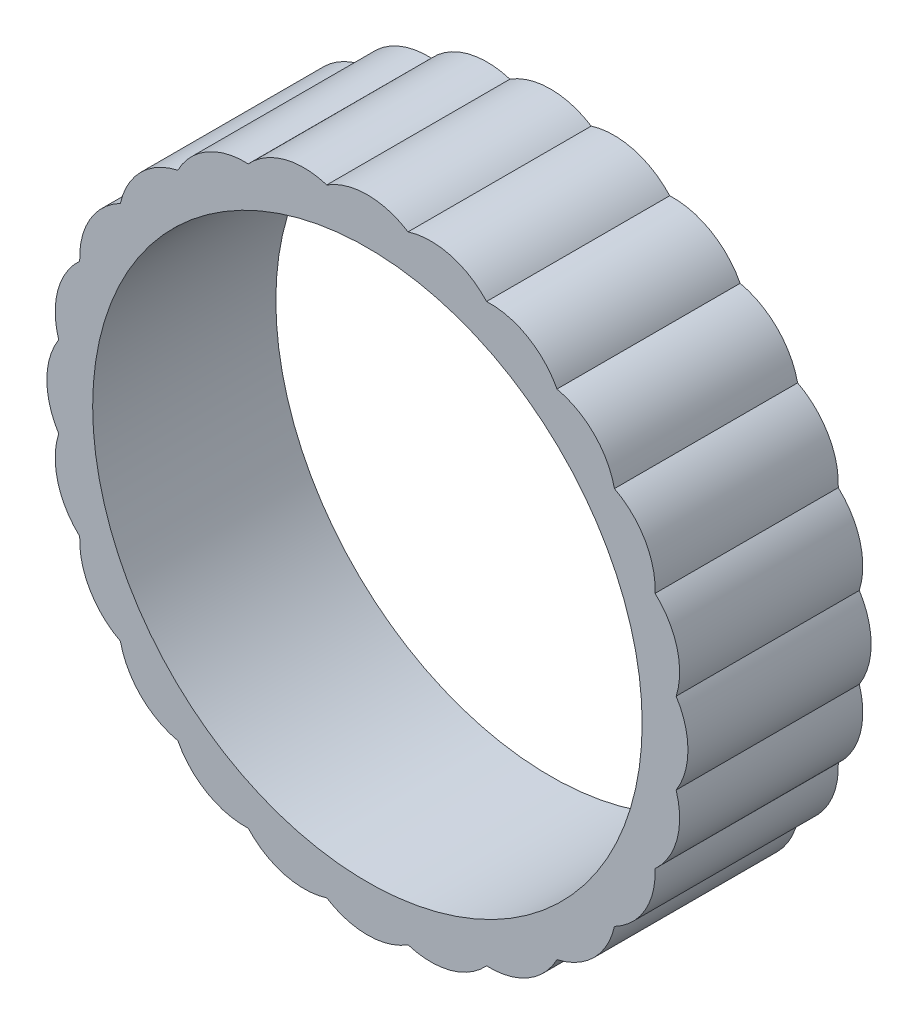
ISO-10303-21;
HEADER;
FILE_DESCRIPTION(('STEP AP214'),'2;1');
FILE_NAME('part.step','',(''),(''),'','','');
FILE_SCHEMA(('AUTOMOTIVE_DESIGN { 1 0 10303 214 1 1 1 1 }'));
ENDSEC;
DATA;
#1=APPLICATION_CONTEXT('core data for automotive mechanical design processes');
#2=APPLICATION_PROTOCOL_DEFINITION('international standard','automotive_design',2000,#1);
#3=PRODUCT_CONTEXT('',#1,'mechanical');
#4=PRODUCT('Part','Part','',(#3));
#5=PRODUCT_RELATED_PRODUCT_CATEGORY('part','',(#4));
#6=PRODUCT_DEFINITION_FORMATION('','',#4);
#7=PRODUCT_DEFINITION_CONTEXT('part definition',#1,'design');
#8=PRODUCT_DEFINITION('design','',#6,#7);
#9=PRODUCT_DEFINITION_SHAPE('','',#8);
#10=(LENGTH_UNIT() NAMED_UNIT(*) SI_UNIT(.MILLI.,.METRE.));
#11=(NAMED_UNIT(*) PLANE_ANGLE_UNIT() SI_UNIT($,.RADIAN.));
#12=(NAMED_UNIT(*) SI_UNIT($,.STERADIAN.) SOLID_ANGLE_UNIT());
#13=UNCERTAINTY_MEASURE_WITH_UNIT(LENGTH_MEASURE(1.E-05),#10,'distance_accuracy_value','');
#14=(GEOMETRIC_REPRESENTATION_CONTEXT(3) GLOBAL_UNCERTAINTY_ASSIGNED_CONTEXT((#13)) GLOBAL_UNIT_ASSIGNED_CONTEXT((#10,
#11,#12)) REPRESENTATION_CONTEXT('',''));
#15=CARTESIAN_POINT('',(0.,0.,0.));
#16=DIRECTION('',(0.,0.,1.));
#17=DIRECTION('',(1.,0.,0.));
#18=AXIS2_PLACEMENT_3D('',#15,#16,#17);
#19=CARTESIAN_POINT('',(0.,0.,10.));
#20=DIRECTION('',(0.,0.,1.));
#21=DIRECTION('',(1.,0.,0.));
#22=AXIS2_PLACEMENT_3D('',#19,#20,#21);
#23=PLANE('',#22);
#24=CARTESIAN_POINT('',(0.,13.3630319212231,10.));
#25=DIRECTION('',(0.,0.,1.));
#26=DIRECTION('',(-1.,0.,0.));
#27=AXIS2_PLACEMENT_3D('',#24,#25,#26);
#28=CIRCLE('',#27,4.1369680787769);
#29=CARTESIAN_POINT('',(2.21894526774064,16.8545626433548,10.));
#30=VERTEX_POINT('',#29);
#31=CARTESIAN_POINT('',(-2.21894526774089,16.8545626433548,10.));
#32=VERTEX_POINT('',#31);
#33=EDGE_CURVE('E210',#30,#32,#28,.T.);
#34=ORIENTED_EDGE('',*,*,#33,.T.);
#35=CARTESIAN_POINT('',(-3.45860716152547,12.9076976502346,10.));
#36=DIRECTION('',(0.,0.,1.));
#37=DIRECTION('',(-0.965925826289068,-0.258819045102521,0.));
#38=AXIS2_PLACEMENT_3D('',#35,#36,#37);
#39=CIRCLE('',#38,4.1369680787769);
#40=CARTESIAN_POINT('',(-6.50561835020655,15.7059520526919,10.));
#41=VERTEX_POINT('',#40);
#42=EDGE_CURVE('E48',#32,#41,#39,.T.);
#43=ORIENTED_EDGE('',*,*,#42,.T.);
#44=CARTESIAN_POINT('',(-6.68151596061156,11.5727251153616,10.));
#45=DIRECTION('',(0.,0.,1.));
#46=DIRECTION('',(-0.866025403784438,-0.500000000000001,0.));
#47=AXIS2_PLACEMENT_3D('',#44,#45,#46);
#48=CIRCLE('',#47,4.1369680787769);
#49=CARTESIAN_POINT('',(-10.3489442931483,13.487006784951,10.));
#50=VERTEX_POINT('',#49);
#51=EDGE_CURVE('E664',#41,#50,#48,.T.);
#52=ORIENTED_EDGE('',*,*,#51,.T.);
#53=CARTESIAN_POINT('',(-9.44909048870917,9.44909048870914,10.));
#54=DIRECTION('',(0.,0.,1.));
#55=DIRECTION('',(-0.707106781186546,-0.707106781186549,0.));
#56=AXIS2_PLACEMENT_3D('',#53,#54,#55);
#57=CIRCLE('',#56,4.1369680787769);
#58=CARTESIAN_POINT('',(-13.487006784951,10.3489442931482,10.));
#59=VERTEX_POINT('',#58);
#60=EDGE_CURVE('E655',#50,#59,#57,.T.);
#61=ORIENTED_EDGE('',*,*,#60,.T.);
#62=CARTESIAN_POINT('',(-11.5727251153616,6.68151596061152,10.));
#63=DIRECTION('',(0.,0.,1.));
#64=DIRECTION('',(-0.499999999999998,-0.86602540378444,0.));
#65=AXIS2_PLACEMENT_3D('',#62,#63,#64);
#66=CIRCLE('',#65,4.1369680787769);
#67=CARTESIAN_POINT('',(-15.7059520526919,6.50561835020648,10.));
#68=VERTEX_POINT('',#67);
#69=EDGE_CURVE('E646',#59,#68,#66,.T.);
#70=ORIENTED_EDGE('',*,*,#69,.T.);
#71=CARTESIAN_POINT('',(-12.9076976502346,3.45860716152543,10.));
#72=DIRECTION('',(0.,0.,1.));
#73=DIRECTION('',(-0.258819045102518,-0.965925826289069,0.));
#74=AXIS2_PLACEMENT_3D('',#71,#72,#73);
#75=CIRCLE('',#74,4.1369680787769);
#76=CARTESIAN_POINT('',(-16.8545626433548,2.21894526774081,10.));
#77=VERTEX_POINT('',#76);
#78=EDGE_CURVE('E637',#68,#77,#75,.T.);
#79=ORIENTED_EDGE('',*,*,#78,.T.);
#80=CARTESIAN_POINT('',(-13.3630319212231,0.,10.));
#81=DIRECTION('',(0.,0.,1.));
#82=DIRECTION('',(0.,-1.,0.));
#83=AXIS2_PLACEMENT_3D('',#80,#81,#82);
#84=CIRCLE('',#83,4.1369680787769);
#85=CARTESIAN_POINT('',(-16.8545626433548,-2.21894526774095,10.));
#86=VERTEX_POINT('',#85);
#87=EDGE_CURVE('E628',#77,#86,#84,.T.);
#88=ORIENTED_EDGE('',*,*,#87,.T.);
#89=CARTESIAN_POINT('',(-12.9076976502346,-3.45860716152552,10.));
#90=DIRECTION('',(0.,0.,1.));
#91=DIRECTION('',(0.258819045102525,-0.965925826289067,0.));
#92=AXIS2_PLACEMENT_3D('',#89,#90,#91);
#93=CIRCLE('',#92,4.1369680787769);
#94=CARTESIAN_POINT('',(-15.7059520526918,-6.50561835020661,10.));
#95=VERTEX_POINT('',#94);
#96=EDGE_CURVE('E619',#86,#95,#93,.T.);
#97=ORIENTED_EDGE('',*,*,#96,.T.);
#98=CARTESIAN_POINT('',(-11.5727251153615,-6.6815159606116,10.));
#99=DIRECTION('',(0.,0.,1.));
#100=DIRECTION('',(0.500000000000004,-0.866025403784436,0.));
#101=AXIS2_PLACEMENT_3D('',#98,#99,#100);
#102=CIRCLE('',#101,4.1369680787769);
#103=CARTESIAN_POINT('',(-13.4870067849509,-10.3489442931483,10.));
#104=VERTEX_POINT('',#103);
#105=EDGE_CURVE('E610',#95,#104,#102,.T.);
#106=ORIENTED_EDGE('',*,*,#105,.T.);
#107=CARTESIAN_POINT('',(-9.4490904887091,-9.4490904887092,10.));
#108=DIRECTION('',(0.,0.,1.));
#109=DIRECTION('',(0.707106781186551,-0.707106781186544,0.));
#110=AXIS2_PLACEMENT_3D('',#107,#108,#109);
#111=CIRCLE('',#110,4.1369680787769);
#112=CARTESIAN_POINT('',(-10.3489442931482,-13.4870067849511,10.));
#113=VERTEX_POINT('',#112);
#114=EDGE_CURVE('E601',#104,#113,#111,.T.);
#115=ORIENTED_EDGE('',*,*,#114,.T.);
#116=CARTESIAN_POINT('',(-6.68151596061148,-11.5727251153616,10.));
#117=DIRECTION('',(0.,0.,1.));
#118=DIRECTION('',(0.866025403784442,-0.499999999999995,0.));
#119=AXIS2_PLACEMENT_3D('',#116,#117,#118);
#120=CIRCLE('',#119,4.1369680787769);
#121=CARTESIAN_POINT('',(-6.50561835020642,-15.7059520526919,10.));
#122=VERTEX_POINT('',#121);
#123=EDGE_CURVE('E592',#113,#122,#120,.T.);
#124=ORIENTED_EDGE('',*,*,#123,.T.);
#125=CARTESIAN_POINT('',(-3.45860716152538,-12.9076976502346,10.));
#126=DIRECTION('',(0.,0.,1.));
#127=DIRECTION('',(0.96592582628907,-0.258819045102515,0.));
#128=AXIS2_PLACEMENT_3D('',#125,#126,#127);
#129=CIRCLE('',#128,4.1369680787769);
#130=CARTESIAN_POINT('',(-2.21894526774075,-16.8545626433548,10.));
#131=VERTEX_POINT('',#130);
#132=EDGE_CURVE('E583',#122,#131,#129,.T.);
#133=ORIENTED_EDGE('',*,*,#132,.T.);
#134=CARTESIAN_POINT('',(0.,-13.3630319212231,10.));
#135=DIRECTION('',(0.,0.,1.));
#136=DIRECTION('',(1.,0.,0.));
#137=AXIS2_PLACEMENT_3D('',#134,#135,#136);
#138=CIRCLE('',#137,4.1369680787769);
#139=CARTESIAN_POINT('',(2.21894526774089,-16.8545626433548,10.));
#140=VERTEX_POINT('',#139);
#141=EDGE_CURVE('E574',#131,#140,#138,.T.);
#142=ORIENTED_EDGE('',*,*,#141,.T.);
#143=CARTESIAN_POINT('',(3.45860716152556,-12.9076976502346,10.));
#144=DIRECTION('',(0.,0.,1.));
#145=DIRECTION('',(0.965925826289066,0.258819045102528,0.));
#146=AXIS2_PLACEMENT_3D('',#143,#144,#145);
#147=CIRCLE('',#146,4.1369680787769);
#148=CARTESIAN_POINT('',(6.50561835020666,-15.7059520526918,10.));
#149=VERTEX_POINT('',#148);
#150=EDGE_CURVE('E565',#140,#149,#147,.T.);
#151=ORIENTED_EDGE('',*,*,#150,.T.);
#152=CARTESIAN_POINT('',(6.68151596061164,-11.5727251153615,10.));
#153=DIRECTION('',(0.,0.,1.));
#154=DIRECTION('',(0.866025403784435,0.500000000000007,0.));
#155=AXIS2_PLACEMENT_3D('',#152,#153,#154);
#156=CIRCLE('',#155,4.1369680787769);
#157=CARTESIAN_POINT('',(10.3489442931484,-13.4870067849509,10.));
#158=VERTEX_POINT('',#157);
#159=EDGE_CURVE('E556',#149,#158,#156,.T.);
#160=ORIENTED_EDGE('',*,*,#159,.T.);
#161=CARTESIAN_POINT('',(9.44909048870923,-9.44909048870907,10.));
#162=DIRECTION('',(0.,0.,1.));
#163=DIRECTION('',(0.707106781186541,0.707106781186554,0.));
#164=AXIS2_PLACEMENT_3D('',#161,#162,#163);
#165=CIRCLE('',#164,4.1369680787769);
#166=CARTESIAN_POINT('',(13.4870067849511,-10.3489442931481,10.));
#167=VERTEX_POINT('',#166);
#168=EDGE_CURVE('E547',#158,#167,#165,.T.);
#169=ORIENTED_EDGE('',*,*,#168,.T.);
#170=CARTESIAN_POINT('',(11.5727251153616,-6.68151596061144,10.));
#171=DIRECTION('',(0.,0.,1.));
#172=DIRECTION('',(0.499999999999992,0.866025403784443,0.));
#173=AXIS2_PLACEMENT_3D('',#170,#171,#172);
#174=CIRCLE('',#173,4.1369680787769);
#175=CARTESIAN_POINT('',(15.7059520526919,-6.50561835020637,10.));
#176=VERTEX_POINT('',#175);
#177=EDGE_CURVE('E538',#167,#176,#174,.T.);
#178=ORIENTED_EDGE('',*,*,#177,.T.);
#179=CARTESIAN_POINT('',(12.9076976502347,-3.45860716152534,10.));
#180=DIRECTION('',(0.,0.,1.));
#181=DIRECTION('',(0.258819045102511,0.965925826289071,0.));
#182=AXIS2_PLACEMENT_3D('',#179,#180,#181);
#183=CIRCLE('',#182,4.1369680787769);
#184=CARTESIAN_POINT('',(16.8545626433548,-2.21894526774069,10.));
#185=VERTEX_POINT('',#184);
#186=EDGE_CURVE('E529',#176,#185,#183,.T.);
#187=ORIENTED_EDGE('',*,*,#186,.T.);
#188=CARTESIAN_POINT('',(13.3630319212231,1.39970329749947E-13,10.));
#189=DIRECTION('',(0.,0.,1.));
#190=DIRECTION('',(0.,1.,0.));
#191=AXIS2_PLACEMENT_3D('',#188,#189,#190);
#192=CIRCLE('',#191,4.1369680787769);
#193=CARTESIAN_POINT('',(16.8545626433548,2.21894526774107,10.));
#194=VERTEX_POINT('',#193);
#195=EDGE_CURVE('E520',#185,#194,#192,.T.);
#196=ORIENTED_EDGE('',*,*,#195,.T.);
#197=CARTESIAN_POINT('',(12.9076976502346,3.45860716152561,10.));
#198=DIRECTION('',(0.,0.,1.));
#199=DIRECTION('',(-0.258819045102531,0.965925826289065,0.));
#200=AXIS2_PLACEMENT_3D('',#197,#198,#199);
#201=CIRCLE('',#200,4.1369680787769);
#202=CARTESIAN_POINT('',(15.7059520526918,6.50561835020672,10.));
#203=VERTEX_POINT('',#202);
#204=EDGE_CURVE('E512',#194,#203,#201,.T.);
#205=ORIENTED_EDGE('',*,*,#204,.T.);
#206=CARTESIAN_POINT('',(11.5727251153615,6.68151596061169,10.));
#207=DIRECTION('',(0.,0.,1.));
#208=DIRECTION('',(-0.50000000000001,0.866025403784433,0.));
#209=AXIS2_PLACEMENT_3D('',#206,#207,#208);
#210=CIRCLE('',#209,4.1369680787769);
#211=CARTESIAN_POINT('',(13.4870067849509,10.3489442931484,10.));
#212=VERTEX_POINT('',#211);
#213=EDGE_CURVE('E497',#203,#212,#210,.T.);
#214=ORIENTED_EDGE('',*,*,#213,.T.);
#215=CARTESIAN_POINT('',(9.44909048870904,9.44909048870927,10.));
#216=DIRECTION('',(0.,0.,1.));
#217=DIRECTION('',(-0.707106781186556,0.707106781186539,0.));
#218=AXIS2_PLACEMENT_3D('',#215,#216,#217);
#219=CIRCLE('',#218,4.1369680787769);
#220=CARTESIAN_POINT('',(10.3489442931481,13.4870067849511,10.));
#221=VERTEX_POINT('',#220);
#222=EDGE_CURVE('E491',#212,#221,#219,.T.);
#223=ORIENTED_EDGE('',*,*,#222,.T.);
#224=CARTESIAN_POINT('',(6.6815159606114,11.5727251153617,10.));
#225=DIRECTION('',(0.,0.,1.));
#226=DIRECTION('',(-0.866025403784445,0.499999999999989,0.));
#227=AXIS2_PLACEMENT_3D('',#224,#225,#226);
#228=CIRCLE('',#227,4.1369680787769);
#229=CARTESIAN_POINT('',(6.50561835020631,15.705952052692,10.));
#230=VERTEX_POINT('',#229);
#231=EDGE_CURVE('E212',#221,#230,#228,.T.);
#232=ORIENTED_EDGE('',*,*,#231,.T.);
#233=CARTESIAN_POINT('',(3.45860716152529,12.9076976502347,10.));
#234=DIRECTION('',(0.,0.,1.));
#235=DIRECTION('',(-0.965925826289072,0.258819045102508,0.));
#236=AXIS2_PLACEMENT_3D('',#233,#234,#235);
#237=CIRCLE('',#236,4.1369680787769);
#238=EDGE_CURVE('E197',#230,#30,#237,.T.);
#239=ORIENTED_EDGE('',*,*,#238,.T.);
#240=EDGE_LOOP('',(#34,#43,#52,#61,#70,#79,#88,#97,#106,#115,#124,#133,#142,#151,#160,#169,#178,
#187,#196,#205,#214,#223,#232,#239));
#241=FACE_BOUND('',#240,.T.);
#242=CARTESIAN_POINT('',(0.,0.,10.));
#243=DIRECTION('',(0.,0.,1.));
#244=DIRECTION('',(1.,0.,0.));
#245=AXIS2_PLACEMENT_3D('',#242,#243,#244);
#246=CIRCLE('',#245,15.);
#247=CARTESIAN_POINT('',(15.,0.,10.));
#248=VERTEX_POINT('',#247);
#249=EDGE_CURVE('E11',#248,#248,#246,.T.);
#250=ORIENTED_EDGE('',*,*,#249,.F.);
#251=EDGE_LOOP('',(#250));
#252=FACE_BOUND('',#251,.T.);
#253=ADVANCED_FACE('F33',(#241,#252),#23,.T.);
#254=CARTESIAN_POINT('',(0.,0.,0.));
#255=DIRECTION('',(0.,0.,1.));
#256=DIRECTION('',(1.,0.,0.));
#257=AXIS2_PLACEMENT_3D('',#254,#255,#256);
#258=PLANE('',#257);
#259=CARTESIAN_POINT('',(0.,13.3630319212231,0.));
#260=DIRECTION('',(0.,0.,1.));
#261=DIRECTION('',(-1.,0.,0.));
#262=AXIS2_PLACEMENT_3D('',#259,#260,#261);
#263=CIRCLE('',#262,4.1369680787769);
#264=CARTESIAN_POINT('',(2.21894526774064,16.8545626433548,0.));
#265=VERTEX_POINT('',#264);
#266=CARTESIAN_POINT('',(-2.21894526774087,16.8545626433548,0.));
#267=VERTEX_POINT('',#266);
#268=EDGE_CURVE('E205',#265,#267,#263,.T.);
#269=ORIENTED_EDGE('',*,*,#268,.F.);
#270=CARTESIAN_POINT('',(3.45860716152529,12.9076976502347,0.));
#271=DIRECTION('',(0.,0.,1.));
#272=DIRECTION('',(-0.965925826289072,0.258819045102508,0.));
#273=AXIS2_PLACEMENT_3D('',#270,#271,#272);
#274=CIRCLE('',#273,4.1369680787769);
#275=CARTESIAN_POINT('',(6.50561835020633,15.705952052692,0.));
#276=VERTEX_POINT('',#275);
#277=EDGE_CURVE('E200',#276,#265,#274,.T.);
#278=ORIENTED_EDGE('',*,*,#277,.F.);
#279=CARTESIAN_POINT('',(6.6815159606114,11.5727251153617,0.));
#280=DIRECTION('',(0.,0.,1.));
#281=DIRECTION('',(-0.866025403784445,0.499999999999989,0.));
#282=AXIS2_PLACEMENT_3D('',#279,#280,#281);
#283=CIRCLE('',#282,4.1369680787769);
#284=CARTESIAN_POINT('',(10.3489442931481,13.4870067849511,0.));
#285=VERTEX_POINT('',#284);
#286=EDGE_CURVE('E213',#285,#276,#283,.T.);
#287=ORIENTED_EDGE('',*,*,#286,.F.);
#288=CARTESIAN_POINT('',(9.44909048870904,9.44909048870927,0.));
#289=DIRECTION('',(0.,0.,1.));
#290=DIRECTION('',(-0.707106781186556,0.707106781186539,0.));
#291=AXIS2_PLACEMENT_3D('',#288,#289,#290);
#292=CIRCLE('',#291,4.1369680787769);
#293=CARTESIAN_POINT('',(13.4870067849509,10.3489442931484,0.));
#294=VERTEX_POINT('',#293);
#295=EDGE_CURVE('E488',#294,#285,#292,.T.);
#296=ORIENTED_EDGE('',*,*,#295,.F.);
#297=CARTESIAN_POINT('',(11.5727251153615,6.68151596061169,0.));
#298=DIRECTION('',(0.,0.,1.));
#299=DIRECTION('',(-0.50000000000001,0.866025403784433,0.));
#300=AXIS2_PLACEMENT_3D('',#297,#298,#299);
#301=CIRCLE('',#300,4.1369680787769);
#302=CARTESIAN_POINT('',(15.7059520526918,6.50561835020669,0.));
#303=VERTEX_POINT('',#302);
#304=EDGE_CURVE('E498',#303,#294,#301,.T.);
#305=ORIENTED_EDGE('',*,*,#304,.F.);
#306=CARTESIAN_POINT('',(12.9076976502346,3.45860716152561,0.));
#307=DIRECTION('',(0.,0.,1.));
#308=DIRECTION('',(-0.258819045102531,0.965925826289065,0.));
#309=AXIS2_PLACEMENT_3D('',#306,#307,#308);
#310=CIRCLE('',#309,4.1369680787769);
#311=CARTESIAN_POINT('',(16.8545626433548,2.21894526774105,0.));
#312=VERTEX_POINT('',#311);
#313=EDGE_CURVE('E507',#312,#303,#310,.T.);
#314=ORIENTED_EDGE('',*,*,#313,.F.);
#315=CARTESIAN_POINT('',(13.3630319212231,1.39970329749947E-13,0.));
#316=DIRECTION('',(0.,0.,1.));
#317=DIRECTION('',(0.,1.,0.));
#318=AXIS2_PLACEMENT_3D('',#315,#316,#317);
#319=CIRCLE('',#318,4.1369680787769);
#320=CARTESIAN_POINT('',(16.8545626433548,-2.21894526774072,0.));
#321=VERTEX_POINT('',#320);
#322=EDGE_CURVE('E514',#321,#312,#319,.T.);
#323=ORIENTED_EDGE('',*,*,#322,.F.);
#324=CARTESIAN_POINT('',(12.9076976502347,-3.45860716152534,0.));
#325=DIRECTION('',(0.,0.,1.));
#326=DIRECTION('',(0.258819045102511,0.965925826289071,0.));
#327=AXIS2_PLACEMENT_3D('',#324,#325,#326);
#328=CIRCLE('',#327,4.1369680787769);
#329=CARTESIAN_POINT('',(15.7059520526919,-6.50561835020639,0.));
#330=VERTEX_POINT('',#329);
#331=EDGE_CURVE('E523',#330,#321,#328,.T.);
#332=ORIENTED_EDGE('',*,*,#331,.F.);
#333=CARTESIAN_POINT('',(11.5727251153616,-6.68151596061144,0.));
#334=DIRECTION('',(0.,0.,1.));
#335=DIRECTION('',(0.499999999999992,0.866025403784443,0.));
#336=AXIS2_PLACEMENT_3D('',#333,#334,#335);
#337=CIRCLE('',#336,4.1369680787769);
#338=CARTESIAN_POINT('',(13.4870067849511,-10.3489442931481,0.));
#339=VERTEX_POINT('',#338);
#340=EDGE_CURVE('E532',#339,#330,#337,.T.);
#341=ORIENTED_EDGE('',*,*,#340,.F.);
#342=CARTESIAN_POINT('',(9.44909048870923,-9.44909048870907,0.));
#343=DIRECTION('',(0.,0.,1.));
#344=DIRECTION('',(0.707106781186541,0.707106781186554,0.));
#345=AXIS2_PLACEMENT_3D('',#342,#343,#344);
#346=CIRCLE('',#345,4.1369680787769);
#347=CARTESIAN_POINT('',(10.3489442931484,-13.4870067849509,0.));
#348=VERTEX_POINT('',#347);
#349=EDGE_CURVE('E541',#348,#339,#346,.T.);
#350=ORIENTED_EDGE('',*,*,#349,.F.);
#351=CARTESIAN_POINT('',(6.68151596061164,-11.5727251153615,0.));
#352=DIRECTION('',(0.,0.,1.));
#353=DIRECTION('',(0.866025403784435,0.500000000000007,0.));
#354=AXIS2_PLACEMENT_3D('',#351,#352,#353);
#355=CIRCLE('',#354,4.1369680787769);
#356=CARTESIAN_POINT('',(6.50561835020664,-15.7059520526918,0.));
#357=VERTEX_POINT('',#356);
#358=EDGE_CURVE('E550',#357,#348,#355,.T.);
#359=ORIENTED_EDGE('',*,*,#358,.F.);
#360=CARTESIAN_POINT('',(3.45860716152556,-12.9076976502346,0.));
#361=DIRECTION('',(0.,0.,1.));
#362=DIRECTION('',(0.965925826289066,0.258819045102528,0.));
#363=AXIS2_PLACEMENT_3D('',#360,#361,#362);
#364=CIRCLE('',#363,4.1369680787769);
#365=CARTESIAN_POINT('',(2.21894526774099,-16.8545626433548,0.));
#366=VERTEX_POINT('',#365);
#367=EDGE_CURVE('E559',#366,#357,#364,.T.);
#368=ORIENTED_EDGE('',*,*,#367,.F.);
#369=CARTESIAN_POINT('',(0.,-13.3630319212231,0.));
#370=DIRECTION('',(0.,0.,1.));
#371=DIRECTION('',(1.,0.,0.));
#372=AXIS2_PLACEMENT_3D('',#369,#370,#371);
#373=CIRCLE('',#372,4.1369680787769);
#374=CARTESIAN_POINT('',(-2.21894526774089,-16.8545626433548,0.));
#375=VERTEX_POINT('',#374);
#376=EDGE_CURVE('E568',#375,#366,#373,.T.);
#377=ORIENTED_EDGE('',*,*,#376,.F.);
#378=CARTESIAN_POINT('',(-3.45860716152538,-12.9076976502346,0.));
#379=DIRECTION('',(0.,0.,1.));
#380=DIRECTION('',(0.96592582628907,-0.258819045102515,0.));
#381=AXIS2_PLACEMENT_3D('',#378,#379,#380);
#382=CIRCLE('',#381,4.1369680787769);
#383=CARTESIAN_POINT('',(-6.50561835020644,-15.7059520526919,0.));
#384=VERTEX_POINT('',#383);
#385=EDGE_CURVE('E577',#384,#375,#382,.T.);
#386=ORIENTED_EDGE('',*,*,#385,.F.);
#387=CARTESIAN_POINT('',(-6.68151596061148,-11.5727251153616,0.));
#388=DIRECTION('',(0.,0.,1.));
#389=DIRECTION('',(0.866025403784442,-0.499999999999995,0.));
#390=AXIS2_PLACEMENT_3D('',#387,#388,#389);
#391=CIRCLE('',#390,4.1369680787769);
#392=CARTESIAN_POINT('',(-10.3489442931482,-13.487006784951,0.));
#393=VERTEX_POINT('',#392);
#394=EDGE_CURVE('E586',#393,#384,#391,.T.);
#395=ORIENTED_EDGE('',*,*,#394,.F.);
#396=CARTESIAN_POINT('',(-9.4490904887091,-9.4490904887092,0.));
#397=DIRECTION('',(0.,0.,1.));
#398=DIRECTION('',(0.707106781186551,-0.707106781186544,0.));
#399=AXIS2_PLACEMENT_3D('',#396,#397,#398);
#400=CIRCLE('',#399,4.1369680787769);
#401=CARTESIAN_POINT('',(-13.487006784951,-10.3489442931483,0.));
#402=VERTEX_POINT('',#401);
#403=EDGE_CURVE('E595',#402,#393,#400,.T.);
#404=ORIENTED_EDGE('',*,*,#403,.F.);
#405=CARTESIAN_POINT('',(-11.5727251153615,-6.6815159606116,0.));
#406=DIRECTION('',(0.,0.,1.));
#407=DIRECTION('',(0.500000000000004,-0.866025403784436,0.));
#408=AXIS2_PLACEMENT_3D('',#405,#406,#407);
#409=CIRCLE('',#408,4.1369680787769);
#410=CARTESIAN_POINT('',(-15.7059520526919,-6.50561835020658,0.));
#411=VERTEX_POINT('',#410);
#412=EDGE_CURVE('E604',#411,#402,#409,.T.);
#413=ORIENTED_EDGE('',*,*,#412,.F.);
#414=CARTESIAN_POINT('',(-12.9076976502346,-3.45860716152552,0.));
#415=DIRECTION('',(0.,0.,1.));
#416=DIRECTION('',(0.258819045102525,-0.965925826289067,0.));
#417=AXIS2_PLACEMENT_3D('',#414,#415,#416);
#418=CIRCLE('',#417,4.1369680787769);
#419=CARTESIAN_POINT('',(-16.8545626433548,-2.21894526774093,0.));
#420=VERTEX_POINT('',#419);
#421=EDGE_CURVE('E613',#420,#411,#418,.T.);
#422=ORIENTED_EDGE('',*,*,#421,.F.);
#423=CARTESIAN_POINT('',(-13.3630319212231,0.,0.));
#424=DIRECTION('',(0.,0.,1.));
#425=DIRECTION('',(0.,-1.,0.));
#426=AXIS2_PLACEMENT_3D('',#423,#424,#425);
#427=CIRCLE('',#426,4.1369680787769);
#428=CARTESIAN_POINT('',(-16.8545626433548,2.21894526774084,0.));
#429=VERTEX_POINT('',#428);
#430=EDGE_CURVE('E622',#429,#420,#427,.T.);
#431=ORIENTED_EDGE('',*,*,#430,.F.);
#432=CARTESIAN_POINT('',(-12.9076976502346,3.45860716152543,0.));
#433=DIRECTION('',(0.,0.,1.));
#434=DIRECTION('',(-0.258819045102518,-0.965925826289069,0.));
#435=AXIS2_PLACEMENT_3D('',#432,#433,#434);
#436=CIRCLE('',#435,4.1369680787769);
#437=CARTESIAN_POINT('',(-15.7059520526919,6.5056183502065,0.));
#438=VERTEX_POINT('',#437);
#439=EDGE_CURVE('E631',#438,#429,#436,.T.);
#440=ORIENTED_EDGE('',*,*,#439,.F.);
#441=CARTESIAN_POINT('',(-11.5727251153616,6.68151596061152,0.));
#442=DIRECTION('',(0.,0.,1.));
#443=DIRECTION('',(-0.499999999999998,-0.86602540378444,0.));
#444=AXIS2_PLACEMENT_3D('',#441,#442,#443);
#445=CIRCLE('',#444,4.1369680787769);
#446=CARTESIAN_POINT('',(-13.487006784951,10.3489442931482,0.));
#447=VERTEX_POINT('',#446);
#448=EDGE_CURVE('E640',#447,#438,#445,.T.);
#449=ORIENTED_EDGE('',*,*,#448,.F.);
#450=CARTESIAN_POINT('',(-9.44909048870917,9.44909048870914,0.));
#451=DIRECTION('',(0.,0.,1.));
#452=DIRECTION('',(-0.707106781186546,-0.707106781186549,0.));
#453=AXIS2_PLACEMENT_3D('',#450,#451,#452);
#454=CIRCLE('',#453,4.1369680787769);
#455=CARTESIAN_POINT('',(-10.3489442931483,13.487006784951,0.));
#456=VERTEX_POINT('',#455);
#457=EDGE_CURVE('E649',#456,#447,#454,.T.);
#458=ORIENTED_EDGE('',*,*,#457,.F.);
#459=CARTESIAN_POINT('',(-6.68151596061156,11.5727251153616,0.));
#460=DIRECTION('',(0.,0.,1.));
#461=DIRECTION('',(-0.866025403784438,-0.500000000000001,0.));
#462=AXIS2_PLACEMENT_3D('',#459,#460,#461);
#463=CIRCLE('',#462,4.1369680787769);
#464=CARTESIAN_POINT('',(-6.50561835020653,15.7059520526919,0.));
#465=VERTEX_POINT('',#464);
#466=EDGE_CURVE('E658',#465,#456,#463,.T.);
#467=ORIENTED_EDGE('',*,*,#466,.F.);
#468=CARTESIAN_POINT('',(-3.45860716152547,12.9076976502346,0.));
#469=DIRECTION('',(0.,0.,1.));
#470=DIRECTION('',(-0.965925826289068,-0.258819045102521,0.));
#471=AXIS2_PLACEMENT_3D('',#468,#469,#470);
#472=CIRCLE('',#471,4.1369680787769);
#473=EDGE_CURVE('E219',#267,#465,#472,.T.);
#474=ORIENTED_EDGE('',*,*,#473,.F.);
#475=EDGE_LOOP('',(#269,#278,#287,#296,#305,#314,#323,#332,#341,#350,#359,#368,#377,#386,#395,
#404,#413,#422,#431,#440,#449,#458,#467,#474));
#476=FACE_BOUND('',#475,.T.);
#477=CARTESIAN_POINT('',(0.,0.,0.));
#478=DIRECTION('',(0.,0.,1.));
#479=DIRECTION('',(1.,0.,0.));
#480=AXIS2_PLACEMENT_3D('',#477,#478,#479);
#481=CIRCLE('',#480,15.);
#482=CARTESIAN_POINT('',(15.,0.,0.));
#483=VERTEX_POINT('',#482);
#484=EDGE_CURVE('E37',#483,#483,#481,.T.);
#485=ORIENTED_EDGE('',*,*,#484,.T.);
#486=EDGE_LOOP('',(#485));
#487=FACE_BOUND('',#486,.T.);
#488=ADVANCED_FACE('F35',(#476,#487),#258,.F.);
#489=CARTESIAN_POINT('',(0.,0.,10.));
#490=DIRECTION('',(0.,0.,-1.));
#491=DIRECTION('',(-1.,0.,0.));
#492=AXIS2_PLACEMENT_3D('',#489,#490,#491);
#493=CYLINDRICAL_SURFACE('',#492,15.);
#494=ORIENTED_EDGE('',*,*,#249,.T.);
#495=EDGE_LOOP('',(#494));
#496=FACE_BOUND('',#495,.T.);
#497=ORIENTED_EDGE('',*,*,#484,.F.);
#498=EDGE_LOOP('',(#497));
#499=FACE_BOUND('',#498,.T.);
#500=ADVANCED_FACE('F226',(#496,#499),#493,.F.);
#501=CARTESIAN_POINT('',(0.,13.3630319212231,0.));
#502=DIRECTION('',(0.,0.,1.));
#503=DIRECTION('',(1.,0.,0.));
#504=AXIS2_PLACEMENT_3D('',#501,#502,#503);
#505=CYLINDRICAL_SURFACE('',#504,4.1369680787769);
#506=ORIENTED_EDGE('',*,*,#33,.F.);
#507=DIRECTION('',(0.,0.,1.));
#508=VECTOR('',#507,1.);
#509=CARTESIAN_POINT('',(2.21894526774089,16.8545626433548,0.));
#510=LINE('',#509,#508);
#511=EDGE_CURVE('E194',#265,#30,#510,.T.);
#512=ORIENTED_EDGE('',*,*,#511,.F.);
#513=ORIENTED_EDGE('',*,*,#268,.T.);
#514=DIRECTION('',(0.,0.,1.));
#515=VECTOR('',#514,1.);
#516=CARTESIAN_POINT('',(-2.21894526774089,16.8545626433548,0.));
#517=LINE('',#516,#515);
#518=EDGE_CURVE('E54',#267,#32,#517,.T.);
#519=ORIENTED_EDGE('',*,*,#518,.T.);
#520=EDGE_LOOP('',(#506,#512,#513,#519));
#521=FACE_BOUND('',#520,.T.);
#522=ADVANCED_FACE('F215',(#521),#505,.T.);
#523=CARTESIAN_POINT('',(-3.45860716152547,12.9076976502346,0.));
#524=DIRECTION('',(0.,0.,1.));
#525=DIRECTION('',(1.,0.,0.));
#526=AXIS2_PLACEMENT_3D('',#523,#524,#525);
#527=CYLINDRICAL_SURFACE('',#526,4.1369680787769);
#528=ORIENTED_EDGE('',*,*,#42,.F.);
#529=ORIENTED_EDGE('',*,*,#518,.F.);
#530=ORIENTED_EDGE('',*,*,#473,.T.);
#531=DIRECTION('',(0.,0.,1.));
#532=VECTOR('',#531,1.);
#533=CARTESIAN_POINT('',(-6.50561835020655,15.7059520526919,0.));
#534=LINE('',#533,#532);
#535=EDGE_CURVE('E216',#465,#41,#534,.T.);
#536=ORIENTED_EDGE('',*,*,#535,.T.);
#537=EDGE_LOOP('',(#528,#529,#530,#536));
#538=FACE_BOUND('',#537,.T.);
#539=ADVANCED_FACE('F234',(#538),#527,.T.);
#540=CARTESIAN_POINT('',(-6.68151596061156,11.5727251153616,0.));
#541=DIRECTION('',(0.,0.,1.));
#542=DIRECTION('',(1.,0.,0.));
#543=AXIS2_PLACEMENT_3D('',#540,#541,#542);
#544=CYLINDRICAL_SURFACE('',#543,4.1369680787769);
#545=ORIENTED_EDGE('',*,*,#51,.F.);
#546=ORIENTED_EDGE('',*,*,#535,.F.);
#547=ORIENTED_EDGE('',*,*,#466,.T.);
#548=DIRECTION('',(0.,0.,1.));
#549=VECTOR('',#548,1.);
#550=CARTESIAN_POINT('',(-10.3489442931483,13.487006784951,0.));
#551=LINE('',#550,#549);
#552=EDGE_CURVE('E661',#456,#50,#551,.T.);
#553=ORIENTED_EDGE('',*,*,#552,.T.);
#554=EDGE_LOOP('',(#545,#546,#547,#553));
#555=FACE_BOUND('',#554,.T.);
#556=ADVANCED_FACE('F262',(#555),#544,.T.);
#557=CARTESIAN_POINT('',(-9.44909048870917,9.44909048870914,0.));
#558=DIRECTION('',(0.,0.,1.));
#559=DIRECTION('',(1.,0.,0.));
#560=AXIS2_PLACEMENT_3D('',#557,#558,#559);
#561=CYLINDRICAL_SURFACE('',#560,4.1369680787769);
#562=ORIENTED_EDGE('',*,*,#60,.F.);
#563=ORIENTED_EDGE('',*,*,#552,.F.);
#564=ORIENTED_EDGE('',*,*,#457,.T.);
#565=DIRECTION('',(0.,0.,1.));
#566=VECTOR('',#565,1.);
#567=CARTESIAN_POINT('',(-13.487006784951,10.3489442931482,0.));
#568=LINE('',#567,#566);
#569=EDGE_CURVE('E652',#447,#59,#568,.T.);
#570=ORIENTED_EDGE('',*,*,#569,.T.);
#571=EDGE_LOOP('',(#562,#563,#564,#570));
#572=FACE_BOUND('',#571,.T.);
#573=ADVANCED_FACE('F271',(#572),#561,.T.);
#574=CARTESIAN_POINT('',(-11.5727251153616,6.68151596061152,0.));
#575=DIRECTION('',(0.,0.,1.));
#576=DIRECTION('',(1.,0.,0.));
#577=AXIS2_PLACEMENT_3D('',#574,#575,#576);
#578=CYLINDRICAL_SURFACE('',#577,4.1369680787769);
#579=ORIENTED_EDGE('',*,*,#69,.F.);
#580=ORIENTED_EDGE('',*,*,#569,.F.);
#581=ORIENTED_EDGE('',*,*,#448,.T.);
#582=DIRECTION('',(0.,0.,1.));
#583=VECTOR('',#582,1.);
#584=CARTESIAN_POINT('',(-15.7059520526919,6.50561835020648,0.));
#585=LINE('',#584,#583);
#586=EDGE_CURVE('E643',#438,#68,#585,.T.);
#587=ORIENTED_EDGE('',*,*,#586,.T.);
#588=EDGE_LOOP('',(#579,#580,#581,#587));
#589=FACE_BOUND('',#588,.T.);
#590=ADVANCED_FACE('F281',(#589),#578,.T.);
#591=CARTESIAN_POINT('',(-12.9076976502346,3.45860716152543,0.));
#592=DIRECTION('',(0.,0.,1.));
#593=DIRECTION('',(1.,0.,0.));
#594=AXIS2_PLACEMENT_3D('',#591,#592,#593);
#595=CYLINDRICAL_SURFACE('',#594,4.1369680787769);
#596=ORIENTED_EDGE('',*,*,#78,.F.);
#597=ORIENTED_EDGE('',*,*,#586,.F.);
#598=ORIENTED_EDGE('',*,*,#439,.T.);
#599=DIRECTION('',(0.,0.,1.));
#600=VECTOR('',#599,1.);
#601=CARTESIAN_POINT('',(-16.8545626433548,2.21894526774081,0.));
#602=LINE('',#601,#600);
#603=EDGE_CURVE('E634',#429,#77,#602,.T.);
#604=ORIENTED_EDGE('',*,*,#603,.T.);
#605=EDGE_LOOP('',(#596,#597,#598,#604));
#606=FACE_BOUND('',#605,.T.);
#607=ADVANCED_FACE('F291',(#606),#595,.T.);
#608=CARTESIAN_POINT('',(-13.3630319212231,0.,0.));
#609=DIRECTION('',(0.,0.,1.));
#610=DIRECTION('',(1.,0.,0.));
#611=AXIS2_PLACEMENT_3D('',#608,#609,#610);
#612=CYLINDRICAL_SURFACE('',#611,4.1369680787769);
#613=ORIENTED_EDGE('',*,*,#87,.F.);
#614=ORIENTED_EDGE('',*,*,#603,.F.);
#615=ORIENTED_EDGE('',*,*,#430,.T.);
#616=DIRECTION('',(0.,0.,1.));
#617=VECTOR('',#616,1.);
#618=CARTESIAN_POINT('',(-16.8545626433548,-2.21894526774095,0.));
#619=LINE('',#618,#617);
#620=EDGE_CURVE('E625',#420,#86,#619,.T.);
#621=ORIENTED_EDGE('',*,*,#620,.T.);
#622=EDGE_LOOP('',(#613,#614,#615,#621));
#623=FACE_BOUND('',#622,.T.);
#624=ADVANCED_FACE('F301',(#623),#612,.T.);
#625=CARTESIAN_POINT('',(-12.9076976502346,-3.45860716152552,0.));
#626=DIRECTION('',(0.,0.,1.));
#627=DIRECTION('',(1.,0.,0.));
#628=AXIS2_PLACEMENT_3D('',#625,#626,#627);
#629=CYLINDRICAL_SURFACE('',#628,4.1369680787769);
#630=ORIENTED_EDGE('',*,*,#96,.F.);
#631=ORIENTED_EDGE('',*,*,#620,.F.);
#632=ORIENTED_EDGE('',*,*,#421,.T.);
#633=DIRECTION('',(0.,0.,1.));
#634=VECTOR('',#633,1.);
#635=CARTESIAN_POINT('',(-15.7059520526918,-6.50561835020661,0.));
#636=LINE('',#635,#634);
#637=EDGE_CURVE('E616',#411,#95,#636,.T.);
#638=ORIENTED_EDGE('',*,*,#637,.T.);
#639=EDGE_LOOP('',(#630,#631,#632,#638));
#640=FACE_BOUND('',#639,.T.);
#641=ADVANCED_FACE('F311',(#640),#629,.T.);
#642=CARTESIAN_POINT('',(-11.5727251153615,-6.6815159606116,0.));
#643=DIRECTION('',(0.,0.,1.));
#644=DIRECTION('',(1.,0.,0.));
#645=AXIS2_PLACEMENT_3D('',#642,#643,#644);
#646=CYLINDRICAL_SURFACE('',#645,4.1369680787769);
#647=ORIENTED_EDGE('',*,*,#105,.F.);
#648=ORIENTED_EDGE('',*,*,#637,.F.);
#649=ORIENTED_EDGE('',*,*,#412,.T.);
#650=DIRECTION('',(0.,0.,1.));
#651=VECTOR('',#650,1.);
#652=CARTESIAN_POINT('',(-13.4870067849509,-10.3489442931483,0.));
#653=LINE('',#652,#651);
#654=EDGE_CURVE('E607',#402,#104,#653,.T.);
#655=ORIENTED_EDGE('',*,*,#654,.T.);
#656=EDGE_LOOP('',(#647,#648,#649,#655));
#657=FACE_BOUND('',#656,.T.);
#658=ADVANCED_FACE('F321',(#657),#646,.T.);
#659=CARTESIAN_POINT('',(-9.4490904887091,-9.4490904887092,0.));
#660=DIRECTION('',(0.,0.,1.));
#661=DIRECTION('',(1.,0.,0.));
#662=AXIS2_PLACEMENT_3D('',#659,#660,#661);
#663=CYLINDRICAL_SURFACE('',#662,4.1369680787769);
#664=ORIENTED_EDGE('',*,*,#114,.F.);
#665=ORIENTED_EDGE('',*,*,#654,.F.);
#666=ORIENTED_EDGE('',*,*,#403,.T.);
#667=DIRECTION('',(0.,0.,1.));
#668=VECTOR('',#667,1.);
#669=CARTESIAN_POINT('',(-10.3489442931482,-13.4870067849511,0.));
#670=LINE('',#669,#668);
#671=EDGE_CURVE('E598',#393,#113,#670,.T.);
#672=ORIENTED_EDGE('',*,*,#671,.T.);
#673=EDGE_LOOP('',(#664,#665,#666,#672));
#674=FACE_BOUND('',#673,.T.);
#675=ADVANCED_FACE('F331',(#674),#663,.T.);
#676=CARTESIAN_POINT('',(-6.68151596061148,-11.5727251153616,0.));
#677=DIRECTION('',(0.,0.,1.));
#678=DIRECTION('',(1.,0.,0.));
#679=AXIS2_PLACEMENT_3D('',#676,#677,#678);
#680=CYLINDRICAL_SURFACE('',#679,4.1369680787769);
#681=ORIENTED_EDGE('',*,*,#123,.F.);
#682=ORIENTED_EDGE('',*,*,#671,.F.);
#683=ORIENTED_EDGE('',*,*,#394,.T.);
#684=DIRECTION('',(0.,0.,1.));
#685=VECTOR('',#684,1.);
#686=CARTESIAN_POINT('',(-6.50561835020642,-15.7059520526919,0.));
#687=LINE('',#686,#685);
#688=EDGE_CURVE('E589',#384,#122,#687,.T.);
#689=ORIENTED_EDGE('',*,*,#688,.T.);
#690=EDGE_LOOP('',(#681,#682,#683,#689));
#691=FACE_BOUND('',#690,.T.);
#692=ADVANCED_FACE('F341',(#691),#680,.T.);
#693=CARTESIAN_POINT('',(-3.45860716152538,-12.9076976502346,0.));
#694=DIRECTION('',(0.,0.,1.));
#695=DIRECTION('',(1.,0.,0.));
#696=AXIS2_PLACEMENT_3D('',#693,#694,#695);
#697=CYLINDRICAL_SURFACE('',#696,4.1369680787769);
#698=ORIENTED_EDGE('',*,*,#132,.F.);
#699=ORIENTED_EDGE('',*,*,#688,.F.);
#700=ORIENTED_EDGE('',*,*,#385,.T.);
#701=DIRECTION('',(0.,0.,1.));
#702=VECTOR('',#701,1.);
#703=CARTESIAN_POINT('',(-2.21894526774075,-16.8545626433548,0.));
#704=LINE('',#703,#702);
#705=EDGE_CURVE('E580',#375,#131,#704,.T.);
#706=ORIENTED_EDGE('',*,*,#705,.T.);
#707=EDGE_LOOP('',(#698,#699,#700,#706));
#708=FACE_BOUND('',#707,.T.);
#709=ADVANCED_FACE('F351',(#708),#697,.T.);
#710=CARTESIAN_POINT('',(0.,-13.3630319212231,0.));
#711=DIRECTION('',(0.,0.,1.));
#712=DIRECTION('',(1.,0.,0.));
#713=AXIS2_PLACEMENT_3D('',#710,#711,#712);
#714=CYLINDRICAL_SURFACE('',#713,4.1369680787769);
#715=ORIENTED_EDGE('',*,*,#141,.F.);
#716=ORIENTED_EDGE('',*,*,#705,.F.);
#717=ORIENTED_EDGE('',*,*,#376,.T.);
#718=DIRECTION('',(0.,0.,1.));
#719=VECTOR('',#718,1.);
#720=CARTESIAN_POINT('',(2.21894526774089,-16.8545626433548,0.));
#721=LINE('',#720,#719);
#722=EDGE_CURVE('E571',#366,#140,#721,.T.);
#723=ORIENTED_EDGE('',*,*,#722,.T.);
#724=EDGE_LOOP('',(#715,#716,#717,#723));
#725=FACE_BOUND('',#724,.T.);
#726=ADVANCED_FACE('F361',(#725),#714,.T.);
#727=CARTESIAN_POINT('',(3.45860716152556,-12.9076976502346,0.));
#728=DIRECTION('',(0.,0.,1.));
#729=DIRECTION('',(1.,0.,0.));
#730=AXIS2_PLACEMENT_3D('',#727,#728,#729);
#731=CYLINDRICAL_SURFACE('',#730,4.1369680787769);
#732=ORIENTED_EDGE('',*,*,#150,.F.);
#733=ORIENTED_EDGE('',*,*,#722,.F.);
#734=ORIENTED_EDGE('',*,*,#367,.T.);
#735=DIRECTION('',(0.,0.,1.));
#736=VECTOR('',#735,1.);
#737=CARTESIAN_POINT('',(6.50561835020666,-15.7059520526918,0.));
#738=LINE('',#737,#736);
#739=EDGE_CURVE('E562',#357,#149,#738,.T.);
#740=ORIENTED_EDGE('',*,*,#739,.T.);
#741=EDGE_LOOP('',(#732,#733,#734,#740));
#742=FACE_BOUND('',#741,.T.);
#743=ADVANCED_FACE('F371',(#742),#731,.T.);
#744=CARTESIAN_POINT('',(6.68151596061164,-11.5727251153615,0.));
#745=DIRECTION('',(0.,0.,1.));
#746=DIRECTION('',(1.,0.,0.));
#747=AXIS2_PLACEMENT_3D('',#744,#745,#746);
#748=CYLINDRICAL_SURFACE('',#747,4.1369680787769);
#749=ORIENTED_EDGE('',*,*,#159,.F.);
#750=ORIENTED_EDGE('',*,*,#739,.F.);
#751=ORIENTED_EDGE('',*,*,#358,.T.);
#752=DIRECTION('',(0.,0.,1.));
#753=VECTOR('',#752,1.);
#754=CARTESIAN_POINT('',(10.3489442931484,-13.4870067849509,0.));
#755=LINE('',#754,#753);
#756=EDGE_CURVE('E553',#348,#158,#755,.T.);
#757=ORIENTED_EDGE('',*,*,#756,.T.);
#758=EDGE_LOOP('',(#749,#750,#751,#757));
#759=FACE_BOUND('',#758,.T.);
#760=ADVANCED_FACE('F381',(#759),#748,.T.);
#761=CARTESIAN_POINT('',(9.44909048870923,-9.44909048870907,0.));
#762=DIRECTION('',(0.,0.,1.));
#763=DIRECTION('',(1.,0.,0.));
#764=AXIS2_PLACEMENT_3D('',#761,#762,#763);
#765=CYLINDRICAL_SURFACE('',#764,4.1369680787769);
#766=ORIENTED_EDGE('',*,*,#168,.F.);
#767=ORIENTED_EDGE('',*,*,#756,.F.);
#768=ORIENTED_EDGE('',*,*,#349,.T.);
#769=DIRECTION('',(0.,0.,1.));
#770=VECTOR('',#769,1.);
#771=CARTESIAN_POINT('',(13.4870067849511,-10.3489442931481,0.));
#772=LINE('',#771,#770);
#773=EDGE_CURVE('E544',#339,#167,#772,.T.);
#774=ORIENTED_EDGE('',*,*,#773,.T.);
#775=EDGE_LOOP('',(#766,#767,#768,#774));
#776=FACE_BOUND('',#775,.T.);
#777=ADVANCED_FACE('F391',(#776),#765,.T.);
#778=CARTESIAN_POINT('',(11.5727251153616,-6.68151596061144,0.));
#779=DIRECTION('',(0.,0.,1.));
#780=DIRECTION('',(1.,0.,0.));
#781=AXIS2_PLACEMENT_3D('',#778,#779,#780);
#782=CYLINDRICAL_SURFACE('',#781,4.1369680787769);
#783=ORIENTED_EDGE('',*,*,#177,.F.);
#784=ORIENTED_EDGE('',*,*,#773,.F.);
#785=ORIENTED_EDGE('',*,*,#340,.T.);
#786=DIRECTION('',(0.,0.,1.));
#787=VECTOR('',#786,1.);
#788=CARTESIAN_POINT('',(15.7059520526919,-6.50561835020637,0.));
#789=LINE('',#788,#787);
#790=EDGE_CURVE('E535',#330,#176,#789,.T.);
#791=ORIENTED_EDGE('',*,*,#790,.T.);
#792=EDGE_LOOP('',(#783,#784,#785,#791));
#793=FACE_BOUND('',#792,.T.);
#794=ADVANCED_FACE('F401',(#793),#782,.T.);
#795=CARTESIAN_POINT('',(12.9076976502347,-3.45860716152534,0.));
#796=DIRECTION('',(0.,0.,1.));
#797=DIRECTION('',(1.,0.,0.));
#798=AXIS2_PLACEMENT_3D('',#795,#796,#797);
#799=CYLINDRICAL_SURFACE('',#798,4.1369680787769);
#800=ORIENTED_EDGE('',*,*,#186,.F.);
#801=ORIENTED_EDGE('',*,*,#790,.F.);
#802=ORIENTED_EDGE('',*,*,#331,.T.);
#803=DIRECTION('',(0.,0.,1.));
#804=VECTOR('',#803,1.);
#805=CARTESIAN_POINT('',(16.8545626433548,-2.21894526774069,0.));
#806=LINE('',#805,#804);
#807=EDGE_CURVE('E526',#321,#185,#806,.T.);
#808=ORIENTED_EDGE('',*,*,#807,.T.);
#809=EDGE_LOOP('',(#800,#801,#802,#808));
#810=FACE_BOUND('',#809,.T.);
#811=ADVANCED_FACE('F411',(#810),#799,.T.);
#812=CARTESIAN_POINT('',(13.3630319212231,1.39970329749947E-13,0.));
#813=DIRECTION('',(0.,0.,1.));
#814=DIRECTION('',(1.,0.,0.));
#815=AXIS2_PLACEMENT_3D('',#812,#813,#814);
#816=CYLINDRICAL_SURFACE('',#815,4.1369680787769);
#817=ORIENTED_EDGE('',*,*,#195,.F.);
#818=ORIENTED_EDGE('',*,*,#807,.F.);
#819=ORIENTED_EDGE('',*,*,#322,.T.);
#820=DIRECTION('',(0.,0.,1.));
#821=VECTOR('',#820,1.);
#822=CARTESIAN_POINT('',(16.8545626433548,2.21894526774107,0.));
#823=LINE('',#822,#821);
#824=EDGE_CURVE('E517',#312,#194,#823,.T.);
#825=ORIENTED_EDGE('',*,*,#824,.T.);
#826=EDGE_LOOP('',(#817,#818,#819,#825));
#827=FACE_BOUND('',#826,.T.);
#828=ADVANCED_FACE('F421',(#827),#816,.T.);
#829=CARTESIAN_POINT('',(12.9076976502346,3.45860716152561,0.));
#830=DIRECTION('',(0.,0.,1.));
#831=DIRECTION('',(1.,0.,0.));
#832=AXIS2_PLACEMENT_3D('',#829,#830,#831);
#833=CYLINDRICAL_SURFACE('',#832,4.1369680787769);
#834=ORIENTED_EDGE('',*,*,#204,.F.);
#835=ORIENTED_EDGE('',*,*,#824,.F.);
#836=ORIENTED_EDGE('',*,*,#313,.T.);
#837=DIRECTION('',(0.,0.,1.));
#838=VECTOR('',#837,1.);
#839=CARTESIAN_POINT('',(15.7059520526918,6.50561835020672,0.));
#840=LINE('',#839,#838);
#841=EDGE_CURVE('E509',#303,#203,#840,.T.);
#842=ORIENTED_EDGE('',*,*,#841,.T.);
#843=EDGE_LOOP('',(#834,#835,#836,#842));
#844=FACE_BOUND('',#843,.T.);
#845=ADVANCED_FACE('F431',(#844),#833,.T.);
#846=CARTESIAN_POINT('',(11.5727251153615,6.68151596061169,0.));
#847=DIRECTION('',(0.,0.,1.));
#848=DIRECTION('',(1.,0.,0.));
#849=AXIS2_PLACEMENT_3D('',#846,#847,#848);
#850=CYLINDRICAL_SURFACE('',#849,4.1369680787769);
#851=ORIENTED_EDGE('',*,*,#213,.F.);
#852=ORIENTED_EDGE('',*,*,#841,.F.);
#853=ORIENTED_EDGE('',*,*,#304,.T.);
#854=DIRECTION('',(0.,0.,1.));
#855=VECTOR('',#854,1.);
#856=CARTESIAN_POINT('',(13.4870067849509,10.3489442931484,0.));
#857=LINE('',#856,#855);
#858=EDGE_CURVE('E501',#294,#212,#857,.T.);
#859=ORIENTED_EDGE('',*,*,#858,.T.);
#860=EDGE_LOOP('',(#851,#852,#853,#859));
#861=FACE_BOUND('',#860,.T.);
#862=ADVANCED_FACE('F441',(#861),#850,.T.);
#863=CARTESIAN_POINT('',(9.44909048870904,9.44909048870927,0.));
#864=DIRECTION('',(0.,0.,1.));
#865=DIRECTION('',(1.,0.,0.));
#866=AXIS2_PLACEMENT_3D('',#863,#864,#865);
#867=CYLINDRICAL_SURFACE('',#866,4.1369680787769);
#868=ORIENTED_EDGE('',*,*,#222,.F.);
#869=ORIENTED_EDGE('',*,*,#858,.F.);
#870=ORIENTED_EDGE('',*,*,#295,.T.);
#871=DIRECTION('',(0.,0.,1.));
#872=VECTOR('',#871,1.);
#873=CARTESIAN_POINT('',(10.3489442931481,13.4870067849511,0.));
#874=LINE('',#873,#872);
#875=EDGE_CURVE('E485',#285,#221,#874,.T.);
#876=ORIENTED_EDGE('',*,*,#875,.T.);
#877=EDGE_LOOP('',(#868,#869,#870,#876));
#878=FACE_BOUND('',#877,.T.);
#879=ADVANCED_FACE('F451',(#878),#867,.T.);
#880=CARTESIAN_POINT('',(6.6815159606114,11.5727251153617,0.));
#881=DIRECTION('',(0.,0.,1.));
#882=DIRECTION('',(1.,0.,0.));
#883=AXIS2_PLACEMENT_3D('',#880,#881,#882);
#884=CYLINDRICAL_SURFACE('',#883,4.1369680787769);
#885=ORIENTED_EDGE('',*,*,#231,.F.);
#886=ORIENTED_EDGE('',*,*,#875,.F.);
#887=ORIENTED_EDGE('',*,*,#286,.T.);
#888=DIRECTION('',(0.,0.,1.));
#889=VECTOR('',#888,1.);
#890=CARTESIAN_POINT('',(6.50561835020631,15.705952052692,0.));
#891=LINE('',#890,#889);
#892=EDGE_CURVE('E487',#276,#230,#891,.T.);
#893=ORIENTED_EDGE('',*,*,#892,.T.);
#894=EDGE_LOOP('',(#885,#886,#887,#893));
#895=FACE_BOUND('',#894,.T.);
#896=ADVANCED_FACE('F461',(#895),#884,.T.);
#897=CARTESIAN_POINT('',(3.45860716152529,12.9076976502347,0.));
#898=DIRECTION('',(0.,0.,1.));
#899=DIRECTION('',(1.,0.,0.));
#900=AXIS2_PLACEMENT_3D('',#897,#898,#899);
#901=CYLINDRICAL_SURFACE('',#900,4.1369680787769);
#902=ORIENTED_EDGE('',*,*,#238,.F.);
#903=ORIENTED_EDGE('',*,*,#892,.F.);
#904=ORIENTED_EDGE('',*,*,#277,.T.);
#905=ORIENTED_EDGE('',*,*,#511,.T.);
#906=EDGE_LOOP('',(#902,#903,#904,#905));
#907=FACE_BOUND('',#906,.T.);
#908=ADVANCED_FACE('F196',(#907),#901,.T.);
#909=CLOSED_SHELL('',(#253,#488,#500,#522,#539,#556,#573,#590,#607,#624,#641,#658,#675,#692,
#709,#726,#743,#760,#777,#794,#811,#828,#845,#862,#879,#896,#908));
#910=MANIFOLD_SOLID_BREP('B2',#909);
#911=ADVANCED_BREP_SHAPE_REPRESENTATION('',(#18,#910),#14);
#912=SHAPE_DEFINITION_REPRESENTATION(#9,#911);
ENDSEC;
END-ISO-10303-21;
